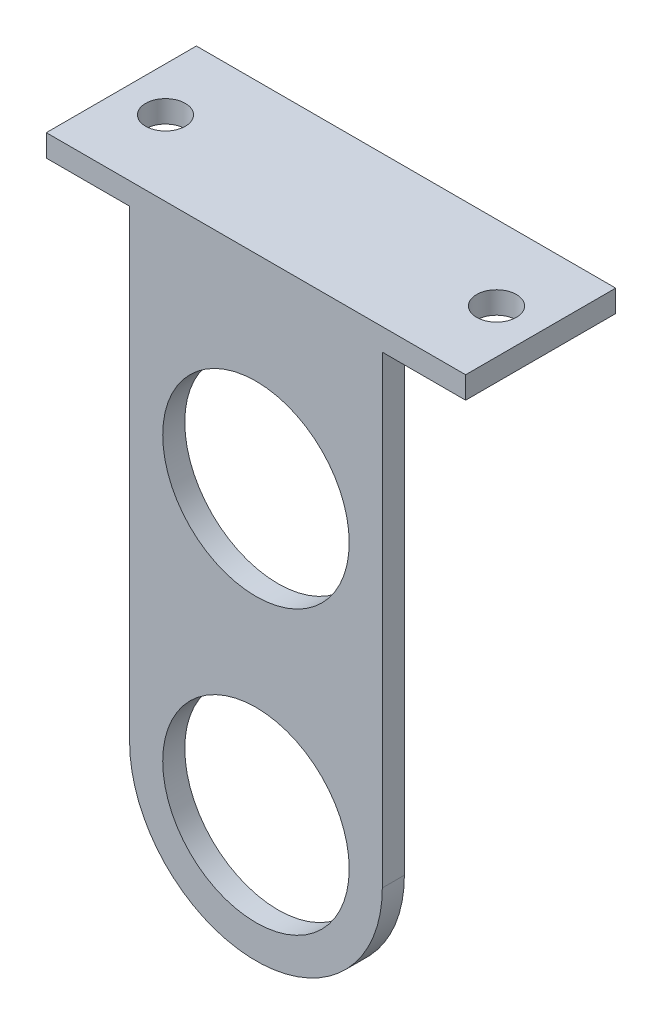
ISO-10303-21;
HEADER;
FILE_DESCRIPTION(('STEP AP214'),'2;1');
FILE_NAME('part.step','',(''),(''),'','','');
FILE_SCHEMA(('AUTOMOTIVE_DESIGN { 1 0 10303 214 1 1 1 1 }'));
ENDSEC;
DATA;
#1=APPLICATION_CONTEXT('core data for automotive mechanical design processes');
#2=APPLICATION_PROTOCOL_DEFINITION('international standard','automotive_design',2000,#1);
#3=PRODUCT_CONTEXT('',#1,'mechanical');
#4=PRODUCT('Part','Part','',(#3));
#5=PRODUCT_RELATED_PRODUCT_CATEGORY('part','',(#4));
#6=PRODUCT_DEFINITION_FORMATION('','',#4);
#7=PRODUCT_DEFINITION_CONTEXT('part definition',#1,'design');
#8=PRODUCT_DEFINITION('design','',#6,#7);
#9=PRODUCT_DEFINITION_SHAPE('','',#8);
#10=(LENGTH_UNIT() NAMED_UNIT(*) SI_UNIT(.MILLI.,.METRE.));
#11=(NAMED_UNIT(*) PLANE_ANGLE_UNIT() SI_UNIT($,.RADIAN.));
#12=(NAMED_UNIT(*) SI_UNIT($,.STERADIAN.) SOLID_ANGLE_UNIT());
#13=UNCERTAINTY_MEASURE_WITH_UNIT(LENGTH_MEASURE(1.E-05),#10,'distance_accuracy_value','');
#14=(GEOMETRIC_REPRESENTATION_CONTEXT(3) GLOBAL_UNCERTAINTY_ASSIGNED_CONTEXT((#13)) GLOBAL_UNIT_ASSIGNED_CONTEXT((#10,
#11,#12)) REPRESENTATION_CONTEXT('',''));
#15=CARTESIAN_POINT('',(0.,0.,0.));
#16=DIRECTION('',(0.,0.,1.));
#17=DIRECTION('',(1.,0.,0.));
#18=AXIS2_PLACEMENT_3D('',#15,#16,#17);
#19=CARTESIAN_POINT('',(0.,-12.8,1.));
#20=DIRECTION('',(0.,0.,1.));
#21=DIRECTION('',(1.,0.,0.));
#22=AXIS2_PLACEMENT_3D('',#19,#20,#21);
#23=PLANE('',#22);
#24=CARTESIAN_POINT('',(0.,12.8,1.));
#25=DIRECTION('',(0.,0.,1.));
#26=DIRECTION('',(1.,0.,0.));
#27=AXIS2_PLACEMENT_3D('',#24,#25,#26);
#28=CIRCLE('',#27,8.45);
#29=CARTESIAN_POINT('',(8.45,12.8,1.));
#30=VERTEX_POINT('',#29);
#31=EDGE_CURVE('E145',#30,#30,#28,.T.);
#32=ORIENTED_EDGE('',*,*,#31,.F.);
#33=EDGE_LOOP('',(#32));
#34=FACE_BOUND('',#33,.T.);
#35=CARTESIAN_POINT('',(0.,-12.8,1.));
#36=DIRECTION('',(0.,0.,1.));
#37=DIRECTION('',(1.,0.,0.));
#38=AXIS2_PLACEMENT_3D('',#35,#36,#37);
#39=CIRCLE('',#38,11.45);
#40=CARTESIAN_POINT('',(-11.45,-12.8,1.));
#41=VERTEX_POINT('',#40);
#42=CARTESIAN_POINT('',(11.45,-12.8,1.));
#43=VERTEX_POINT('',#42);
#44=EDGE_CURVE('E151',#41,#43,#39,.T.);
#45=ORIENTED_EDGE('',*,*,#44,.T.);
#46=DIRECTION('',(0.,1.,0.));
#47=VECTOR('',#46,1.);
#48=CARTESIAN_POINT('',(11.45,-12.8,1.));
#49=LINE('',#48,#47);
#50=CARTESIAN_POINT('',(11.45,29.25,1.));
#51=VERTEX_POINT('',#50);
#52=EDGE_CURVE('E78',#43,#51,#49,.T.);
#53=ORIENTED_EDGE('',*,*,#52,.T.);
#54=DIRECTION('',(1.,0.,0.));
#55=VECTOR('',#54,1.);
#56=CARTESIAN_POINT('',(-19.,29.25,0.999999999999998));
#57=LINE('',#56,#55);
#58=CARTESIAN_POINT('',(19.,29.25,0.999999999999998));
#59=VERTEX_POINT('',#58);
#60=EDGE_CURVE('E171',#51,#59,#57,.T.);
#61=ORIENTED_EDGE('',*,*,#60,.T.);
#62=DIRECTION('',(0.,-1.,0.));
#63=VECTOR('',#62,1.);
#64=CARTESIAN_POINT('',(19.,31.25,0.999999999999998));
#65=LINE('',#64,#63);
#66=CARTESIAN_POINT('',(19.,31.25,0.999999999999998));
#67=VERTEX_POINT('',#66);
#68=EDGE_CURVE('E114',#67,#59,#65,.T.);
#69=ORIENTED_EDGE('',*,*,#68,.F.);
#70=DIRECTION('',(1.,0.,0.));
#71=VECTOR('',#70,1.);
#72=CARTESIAN_POINT('',(-19.,31.25,0.999999999999998));
#73=LINE('',#72,#71);
#74=CARTESIAN_POINT('',(-19.,31.25,0.999999999999998));
#75=VERTEX_POINT('',#74);
#76=EDGE_CURVE('E107',#75,#67,#73,.T.);
#77=ORIENTED_EDGE('',*,*,#76,.F.);
#78=DIRECTION('',(0.,-1.,0.));
#79=VECTOR('',#78,1.);
#80=CARTESIAN_POINT('',(-19.,31.25,0.999999999999998));
#81=LINE('',#80,#79);
#82=CARTESIAN_POINT('',(-19.,29.25,0.999999999999998));
#83=VERTEX_POINT('',#82);
#84=EDGE_CURVE('E111',#75,#83,#81,.T.);
#85=ORIENTED_EDGE('',*,*,#84,.T.);
#86=CARTESIAN_POINT('',(-11.45,29.25,1.));
#87=VERTEX_POINT('',#86);
#88=EDGE_CURVE('E181',#83,#87,#57,.T.);
#89=ORIENTED_EDGE('',*,*,#88,.T.);
#90=DIRECTION('',(0.,-1.,0.));
#91=VECTOR('',#90,1.);
#92=CARTESIAN_POINT('',(-11.45,-12.8,1.));
#93=LINE('',#92,#91);
#94=EDGE_CURVE('E54',#87,#41,#93,.T.);
#95=ORIENTED_EDGE('',*,*,#94,.T.);
#96=EDGE_LOOP('',(#45,#53,#61,#69,#77,#85,#89,#95));
#97=FACE_BOUND('',#96,.T.);
#98=CARTESIAN_POINT('',(0.,-12.8,1.));
#99=DIRECTION('',(0.,0.,1.));
#100=DIRECTION('',(-1.,0.,0.));
#101=AXIS2_PLACEMENT_3D('',#98,#99,#100);
#102=CIRCLE('',#101,8.45);
#103=CARTESIAN_POINT('',(-8.45,-12.8,1.));
#104=VERTEX_POINT('',#103);
#105=EDGE_CURVE('E136',#104,#104,#102,.T.);
#106=ORIENTED_EDGE('',*,*,#105,.F.);
#107=EDGE_LOOP('',(#106));
#108=FACE_BOUND('',#107,.T.);
#109=ADVANCED_FACE('F37',(#34,#97,#108),#23,.T.);
#110=CARTESIAN_POINT('',(0.,-12.8,-1.));
#111=DIRECTION('',(0.,0.,1.));
#112=DIRECTION('',(1.,0.,0.));
#113=AXIS2_PLACEMENT_3D('',#110,#111,#112);
#114=PLANE('',#113);
#115=CARTESIAN_POINT('',(0.,-12.8,-1.));
#116=DIRECTION('',(0.,0.,1.));
#117=DIRECTION('',(1.,0.,0.));
#118=AXIS2_PLACEMENT_3D('',#115,#116,#117);
#119=CIRCLE('',#118,11.45);
#120=CARTESIAN_POINT('',(-11.45,-12.8,-1.));
#121=VERTEX_POINT('',#120);
#122=CARTESIAN_POINT('',(11.45,-12.8,-1.));
#123=VERTEX_POINT('',#122);
#124=EDGE_CURVE('E148',#121,#123,#119,.T.);
#125=ORIENTED_EDGE('',*,*,#124,.F.);
#126=DIRECTION('',(0.,-1.,0.));
#127=VECTOR('',#126,1.);
#128=CARTESIAN_POINT('',(-11.45,-12.8,-1.));
#129=LINE('',#128,#127);
#130=CARTESIAN_POINT('',(-11.45,29.25,-1.));
#131=VERTEX_POINT('',#130);
#132=EDGE_CURVE('E71',#131,#121,#129,.T.);
#133=ORIENTED_EDGE('',*,*,#132,.F.);
#134=DIRECTION('',(-1.,0.,0.));
#135=VECTOR('',#134,1.);
#136=CARTESIAN_POINT('',(-11.45,29.25,-1.));
#137=LINE('',#136,#135);
#138=CARTESIAN_POINT('',(11.45,29.25,-1.));
#139=VERTEX_POINT('',#138);
#140=EDGE_CURVE('E161',#139,#131,#137,.T.);
#141=ORIENTED_EDGE('',*,*,#140,.F.);
#142=DIRECTION('',(0.,1.,0.));
#143=VECTOR('',#142,1.);
#144=CARTESIAN_POINT('',(11.45,-12.8,-1.));
#145=LINE('',#144,#143);
#146=EDGE_CURVE('E158',#123,#139,#145,.T.);
#147=ORIENTED_EDGE('',*,*,#146,.F.);
#148=EDGE_LOOP('',(#125,#133,#141,#147));
#149=FACE_BOUND('',#148,.T.);
#150=CARTESIAN_POINT('',(0.,12.8,-1.));
#151=DIRECTION('',(0.,0.,1.));
#152=DIRECTION('',(1.,0.,0.));
#153=AXIS2_PLACEMENT_3D('',#150,#151,#152);
#154=CIRCLE('',#153,8.45);
#155=CARTESIAN_POINT('',(8.45,12.8,-1.));
#156=VERTEX_POINT('',#155);
#157=EDGE_CURVE('E143',#156,#156,#154,.T.);
#158=ORIENTED_EDGE('',*,*,#157,.T.);
#159=EDGE_LOOP('',(#158));
#160=FACE_BOUND('',#159,.T.);
#161=CARTESIAN_POINT('',(0.,-12.8,-1.));
#162=DIRECTION('',(0.,0.,1.));
#163=DIRECTION('',(-1.,0.,0.));
#164=AXIS2_PLACEMENT_3D('',#161,#162,#163);
#165=CIRCLE('',#164,8.45);
#166=CARTESIAN_POINT('',(-8.45,-12.8,-1.));
#167=VERTEX_POINT('',#166);
#168=EDGE_CURVE('E133',#167,#167,#165,.T.);
#169=ORIENTED_EDGE('',*,*,#168,.T.);
#170=EDGE_LOOP('',(#169));
#171=FACE_BOUND('',#170,.T.);
#172=ADVANCED_FACE('F176',(#149,#160,#171),#114,.F.);
#173=CARTESIAN_POINT('',(0.,-12.8,1.));
#174=DIRECTION('',(0.,0.,-1.));
#175=DIRECTION('',(-1.,0.,0.));
#176=AXIS2_PLACEMENT_3D('',#173,#174,#175);
#177=CYLINDRICAL_SURFACE('',#176,11.45);
#178=ORIENTED_EDGE('',*,*,#124,.T.);
#179=DIRECTION('',(0.,0.,-1.));
#180=VECTOR('',#179,1.);
#181=CARTESIAN_POINT('',(11.45,-12.8,1.));
#182=LINE('',#181,#180);
#183=EDGE_CURVE('E11',#43,#123,#182,.T.);
#184=ORIENTED_EDGE('',*,*,#183,.F.);
#185=ORIENTED_EDGE('',*,*,#44,.F.);
#186=DIRECTION('',(0.,0.,-1.));
#187=VECTOR('',#186,1.);
#188=CARTESIAN_POINT('',(-11.45,-12.8,1.));
#189=LINE('',#188,#187);
#190=EDGE_CURVE('E155',#41,#121,#189,.T.);
#191=ORIENTED_EDGE('',*,*,#190,.T.);
#192=EDGE_LOOP('',(#178,#184,#185,#191));
#193=FACE_BOUND('',#192,.T.);
#194=ADVANCED_FACE('F39',(#193),#177,.T.);
#195=CARTESIAN_POINT('',(11.45,-12.8,1.));
#196=DIRECTION('',(-1.,0.,0.));
#197=DIRECTION('',(0.,-1.,0.));
#198=AXIS2_PLACEMENT_3D('',#195,#196,#197);
#199=PLANE('',#198);
#200=ORIENTED_EDGE('',*,*,#146,.T.);
#201=DIRECTION('',(0.,0.,-1.));
#202=VECTOR('',#201,1.);
#203=CARTESIAN_POINT('',(11.45,29.25,1.));
#204=LINE('',#203,#202);
#205=EDGE_CURVE('E46',#51,#139,#204,.T.);
#206=ORIENTED_EDGE('',*,*,#205,.F.);
#207=ORIENTED_EDGE('',*,*,#52,.F.);
#208=ORIENTED_EDGE('',*,*,#183,.T.);
#209=EDGE_LOOP('',(#200,#206,#207,#208));
#210=FACE_BOUND('',#209,.T.);
#211=ADVANCED_FACE('F172',(#210),#199,.F.);
#212=CARTESIAN_POINT('',(-11.45,-12.8,1.));
#213=DIRECTION('',(1.,0.,0.));
#214=DIRECTION('',(0.,0.,-1.));
#215=AXIS2_PLACEMENT_3D('',#212,#213,#214);
#216=PLANE('',#215);
#217=ORIENTED_EDGE('',*,*,#132,.T.);
#218=ORIENTED_EDGE('',*,*,#190,.F.);
#219=ORIENTED_EDGE('',*,*,#94,.F.);
#220=DIRECTION('',(0.,0.,-1.));
#221=VECTOR('',#220,1.);
#222=CARTESIAN_POINT('',(-11.45,29.25,1.));
#223=LINE('',#222,#221);
#224=EDGE_CURVE('E68',#87,#131,#223,.T.);
#225=ORIENTED_EDGE('',*,*,#224,.T.);
#226=EDGE_LOOP('',(#217,#218,#219,#225));
#227=FACE_BOUND('',#226,.T.);
#228=ADVANCED_FACE('F180',(#227),#216,.F.);
#229=CARTESIAN_POINT('',(0.,12.8,1.));
#230=DIRECTION('',(0.,0.,-1.));
#231=DIRECTION('',(-1.,0.,0.));
#232=AXIS2_PLACEMENT_3D('',#229,#230,#231);
#233=CYLINDRICAL_SURFACE('',#232,8.45);
#234=ORIENTED_EDGE('',*,*,#31,.T.);
#235=EDGE_LOOP('',(#234));
#236=FACE_BOUND('',#235,.T.);
#237=ORIENTED_EDGE('',*,*,#157,.F.);
#238=EDGE_LOOP('',(#237));
#239=FACE_BOUND('',#238,.T.);
#240=ADVANCED_FACE('F228',(#236,#239),#233,.F.);
#241=CARTESIAN_POINT('',(0.,-12.8,1.));
#242=DIRECTION('',(0.,0.,-1.));
#243=DIRECTION('',(-1.,0.,0.));
#244=AXIS2_PLACEMENT_3D('',#241,#242,#243);
#245=CYLINDRICAL_SURFACE('',#244,8.45);
#246=ORIENTED_EDGE('',*,*,#105,.T.);
#247=EDGE_LOOP('',(#246));
#248=FACE_BOUND('',#247,.T.);
#249=ORIENTED_EDGE('',*,*,#168,.F.);
#250=EDGE_LOOP('',(#249));
#251=FACE_BOUND('',#250,.T.);
#252=ADVANCED_FACE('F268',(#248,#251),#245,.F.);
#253=CARTESIAN_POINT('',(0.,29.25,0.));
#254=DIRECTION('',(0.,-1.,0.));
#255=DIRECTION('',(1.,0.,0.));
#256=AXIS2_PLACEMENT_3D('',#253,#254,#255);
#257=PLANE('',#256);
#258=CARTESIAN_POINT('',(15.,29.25,-5.8));
#259=DIRECTION('',(0.,1.,0.));
#260=DIRECTION('',(1.,0.,0.));
#261=AXIS2_PLACEMENT_3D('',#258,#259,#260);
#262=CIRCLE('',#261,1.8);
#263=CARTESIAN_POINT('',(16.8,29.25,-5.8));
#264=VERTEX_POINT('',#263);
#265=EDGE_CURVE('E206',#264,#264,#262,.T.);
#266=ORIENTED_EDGE('',*,*,#265,.T.);
#267=EDGE_LOOP('',(#266));
#268=FACE_BOUND('',#267,.T.);
#269=CARTESIAN_POINT('',(-15.,29.25,-5.8));
#270=DIRECTION('',(0.,1.,0.));
#271=DIRECTION('',(-1.,0.,0.));
#272=AXIS2_PLACEMENT_3D('',#269,#270,#271);
#273=CIRCLE('',#272,1.8);
#274=CARTESIAN_POINT('',(-16.8,29.25,-5.8));
#275=VERTEX_POINT('',#274);
#276=EDGE_CURVE('E198',#275,#275,#273,.T.);
#277=ORIENTED_EDGE('',*,*,#276,.T.);
#278=EDGE_LOOP('',(#277));
#279=FACE_BOUND('',#278,.T.);
#280=ORIENTED_EDGE('',*,*,#224,.F.);
#281=ORIENTED_EDGE('',*,*,#88,.F.);
#282=DIRECTION('',(0.,0.,1.));
#283=VECTOR('',#282,1.);
#284=CARTESIAN_POINT('',(-19.,29.25,0.999999999999998));
#285=LINE('',#284,#283);
#286=CARTESIAN_POINT('',(-19.,29.25,-12.6));
#287=VERTEX_POINT('',#286);
#288=EDGE_CURVE('E132',#287,#83,#285,.T.);
#289=ORIENTED_EDGE('',*,*,#288,.F.);
#290=DIRECTION('',(-1.,0.,0.));
#291=VECTOR('',#290,1.);
#292=CARTESIAN_POINT('',(-19.,29.25,-12.6));
#293=LINE('',#292,#291);
#294=CARTESIAN_POINT('',(19.,29.25,-12.6));
#295=VERTEX_POINT('',#294);
#296=EDGE_CURVE('E128',#295,#287,#293,.T.);
#297=ORIENTED_EDGE('',*,*,#296,.F.);
#298=DIRECTION('',(0.,0.,-1.));
#299=VECTOR('',#298,1.);
#300=CARTESIAN_POINT('',(19.,29.25,0.999999999999998));
#301=LINE('',#300,#299);
#302=EDGE_CURVE('E182',#59,#295,#301,.T.);
#303=ORIENTED_EDGE('',*,*,#302,.F.);
#304=ORIENTED_EDGE('',*,*,#60,.F.);
#305=ORIENTED_EDGE('',*,*,#205,.T.);
#306=ORIENTED_EDGE('',*,*,#140,.T.);
#307=EDGE_LOOP('',(#280,#281,#289,#297,#303,#304,#305,#306));
#308=FACE_BOUND('',#307,.T.);
#309=ADVANCED_FACE('F169',(#268,#279,#308),#257,.T.);
#310=CARTESIAN_POINT('',(0.,31.25,0.));
#311=DIRECTION('',(0.,-1.,0.));
#312=DIRECTION('',(1.,0.,0.));
#313=AXIS2_PLACEMENT_3D('',#310,#311,#312);
#314=PLANE('',#313);
#315=DIRECTION('',(0.,0.,1.));
#316=VECTOR('',#315,1.);
#317=CARTESIAN_POINT('',(-19.,31.25,0.999999999999998));
#318=LINE('',#317,#316);
#319=CARTESIAN_POINT('',(-19.,31.25,-12.6));
#320=VERTEX_POINT('',#319);
#321=EDGE_CURVE('E118',#320,#75,#318,.T.);
#322=ORIENTED_EDGE('',*,*,#321,.T.);
#323=ORIENTED_EDGE('',*,*,#76,.T.);
#324=DIRECTION('',(0.,0.,-1.));
#325=VECTOR('',#324,1.);
#326=CARTESIAN_POINT('',(19.,31.25,0.999999999999998));
#327=LINE('',#326,#325);
#328=CARTESIAN_POINT('',(19.,31.25,-12.6));
#329=VERTEX_POINT('',#328);
#330=EDGE_CURVE('E117',#67,#329,#327,.T.);
#331=ORIENTED_EDGE('',*,*,#330,.T.);
#332=DIRECTION('',(-1.,0.,0.));
#333=VECTOR('',#332,1.);
#334=CARTESIAN_POINT('',(-19.,31.25,-12.6));
#335=LINE('',#334,#333);
#336=EDGE_CURVE('E124',#329,#320,#335,.T.);
#337=ORIENTED_EDGE('',*,*,#336,.T.);
#338=EDGE_LOOP('',(#322,#323,#331,#337));
#339=FACE_BOUND('',#338,.T.);
#340=CARTESIAN_POINT('',(-15.,31.25,-5.8));
#341=DIRECTION('',(0.,1.,0.));
#342=DIRECTION('',(-1.,0.,0.));
#343=AXIS2_PLACEMENT_3D('',#340,#341,#342);
#344=CIRCLE('',#343,1.8);
#345=CARTESIAN_POINT('',(-16.8,31.25,-5.8));
#346=VERTEX_POINT('',#345);
#347=EDGE_CURVE('E196',#346,#346,#344,.T.);
#348=ORIENTED_EDGE('',*,*,#347,.F.);
#349=EDGE_LOOP('',(#348));
#350=FACE_BOUND('',#349,.T.);
#351=CARTESIAN_POINT('',(15.,31.25,-5.8));
#352=DIRECTION('',(0.,1.,0.));
#353=DIRECTION('',(1.,0.,0.));
#354=AXIS2_PLACEMENT_3D('',#351,#352,#353);
#355=CIRCLE('',#354,1.8);
#356=CARTESIAN_POINT('',(16.8,31.25,-5.8));
#357=VERTEX_POINT('',#356);
#358=EDGE_CURVE('E203',#357,#357,#355,.T.);
#359=ORIENTED_EDGE('',*,*,#358,.F.);
#360=EDGE_LOOP('',(#359));
#361=FACE_BOUND('',#360,.T.);
#362=ADVANCED_FACE('F121',(#339,#350,#361),#314,.F.);
#363=CARTESIAN_POINT('',(-19.,31.25,0.999999999999998));
#364=DIRECTION('',(1.,0.,0.));
#365=DIRECTION('',(0.,1.,0.));
#366=AXIS2_PLACEMENT_3D('',#363,#364,#365);
#367=PLANE('',#366);
#368=ORIENTED_EDGE('',*,*,#288,.T.);
#369=ORIENTED_EDGE('',*,*,#84,.F.);
#370=ORIENTED_EDGE('',*,*,#321,.F.);
#371=DIRECTION('',(0.,-1.,0.));
#372=VECTOR('',#371,1.);
#373=CARTESIAN_POINT('',(-19.,31.25,-12.6));
#374=LINE('',#373,#372);
#375=EDGE_CURVE('E189',#320,#287,#374,.T.);
#376=ORIENTED_EDGE('',*,*,#375,.T.);
#377=EDGE_LOOP('',(#368,#369,#370,#376));
#378=FACE_BOUND('',#377,.T.);
#379=ADVANCED_FACE('F130',(#378),#367,.F.);
#380=CARTESIAN_POINT('',(19.,31.25,0.999999999999998));
#381=DIRECTION('',(-1.,0.,0.));
#382=DIRECTION('',(0.,-1.,0.));
#383=AXIS2_PLACEMENT_3D('',#380,#381,#382);
#384=PLANE('',#383);
#385=ORIENTED_EDGE('',*,*,#302,.T.);
#386=DIRECTION('',(0.,-1.,0.));
#387=VECTOR('',#386,1.);
#388=CARTESIAN_POINT('',(19.,31.25,-12.6));
#389=LINE('',#388,#387);
#390=EDGE_CURVE('E138',#329,#295,#389,.T.);
#391=ORIENTED_EDGE('',*,*,#390,.F.);
#392=ORIENTED_EDGE('',*,*,#330,.F.);
#393=ORIENTED_EDGE('',*,*,#68,.T.);
#394=EDGE_LOOP('',(#385,#391,#392,#393));
#395=FACE_BOUND('',#394,.T.);
#396=ADVANCED_FACE('F209',(#395),#384,.F.);
#397=CARTESIAN_POINT('',(-19.,31.25,-12.6));
#398=DIRECTION('',(0.,0.,1.));
#399=DIRECTION('',(1.,0.,0.));
#400=AXIS2_PLACEMENT_3D('',#397,#398,#399);
#401=PLANE('',#400);
#402=ORIENTED_EDGE('',*,*,#296,.T.);
#403=ORIENTED_EDGE('',*,*,#375,.F.);
#404=ORIENTED_EDGE('',*,*,#336,.F.);
#405=ORIENTED_EDGE('',*,*,#390,.T.);
#406=EDGE_LOOP('',(#402,#403,#404,#405));
#407=FACE_BOUND('',#406,.T.);
#408=ADVANCED_FACE('F194',(#407),#401,.F.);
#409=CARTESIAN_POINT('',(-15.,31.25,-5.8));
#410=DIRECTION('',(0.,-1.,0.));
#411=DIRECTION('',(1.,0.,0.));
#412=AXIS2_PLACEMENT_3D('',#409,#410,#411);
#413=CYLINDRICAL_SURFACE('',#412,1.8);
#414=ORIENTED_EDGE('',*,*,#347,.T.);
#415=EDGE_LOOP('',(#414));
#416=FACE_BOUND('',#415,.T.);
#417=ORIENTED_EDGE('',*,*,#276,.F.);
#418=EDGE_LOOP('',(#417));
#419=FACE_BOUND('',#418,.T.);
#420=ADVANCED_FACE('F216',(#416,#419),#413,.F.);
#421=CARTESIAN_POINT('',(15.,31.25,-5.8));
#422=DIRECTION('',(0.,-1.,0.));
#423=DIRECTION('',(1.,0.,0.));
#424=AXIS2_PLACEMENT_3D('',#421,#422,#423);
#425=CYLINDRICAL_SURFACE('',#424,1.8);
#426=ORIENTED_EDGE('',*,*,#358,.T.);
#427=EDGE_LOOP('',(#426));
#428=FACE_BOUND('',#427,.T.);
#429=ORIENTED_EDGE('',*,*,#265,.F.);
#430=EDGE_LOOP('',(#429));
#431=FACE_BOUND('',#430,.T.);
#432=ADVANCED_FACE('F303',(#428,#431),#425,.F.);
#433=CLOSED_SHELL('',(#109,#172,#194,#211,#228,#240,#252,#309,#362,#379,#396,#408,#420,#432));
#434=MANIFOLD_SOLID_BREP('B2',#433);
#435=ADVANCED_BREP_SHAPE_REPRESENTATION('',(#18,#434),#14);
#436=SHAPE_DEFINITION_REPRESENTATION(#9,#435);
ENDSEC;
END-ISO-10303-21;
